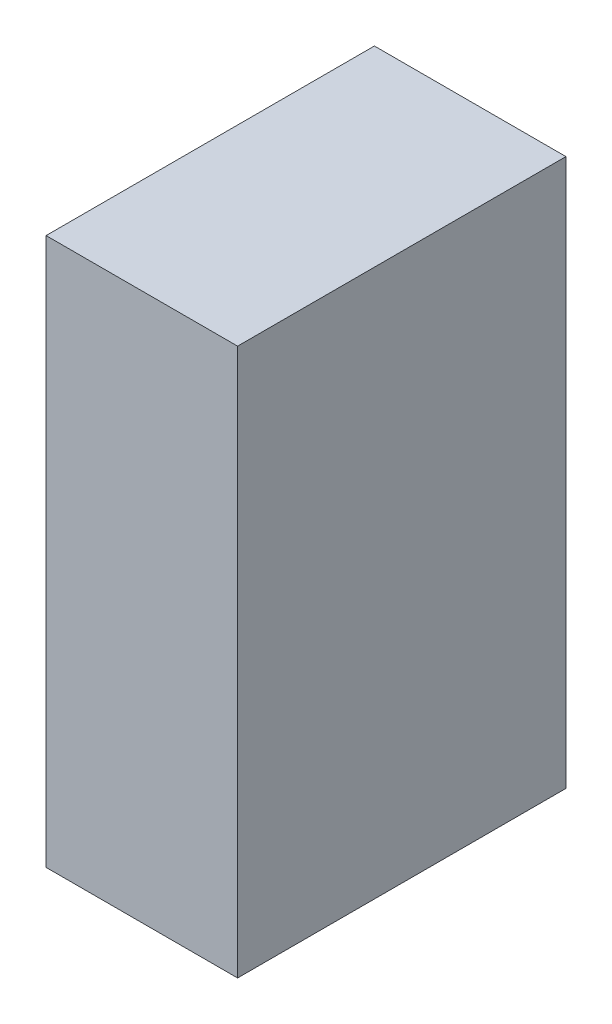
ISO-10303-21;
HEADER;
FILE_DESCRIPTION(('STEP AP214'),'2;1');
FILE_NAME('part.step','',(''),(''),'','','');
FILE_SCHEMA(('AUTOMOTIVE_DESIGN { 1 0 10303 214 1 1 1 1 }'));
ENDSEC;
DATA;
#1=APPLICATION_CONTEXT('core data for automotive mechanical design processes');
#2=APPLICATION_PROTOCOL_DEFINITION('international standard','automotive_design',2000,#1);
#3=PRODUCT_CONTEXT('',#1,'mechanical');
#4=PRODUCT('Part','Part','',(#3));
#5=PRODUCT_RELATED_PRODUCT_CATEGORY('part','',(#4));
#6=PRODUCT_DEFINITION_FORMATION('','',#4);
#7=PRODUCT_DEFINITION_CONTEXT('part definition',#1,'design');
#8=PRODUCT_DEFINITION('design','',#6,#7);
#9=PRODUCT_DEFINITION_SHAPE('','',#8);
#10=(LENGTH_UNIT() NAMED_UNIT(*) SI_UNIT(.MILLI.,.METRE.));
#11=(NAMED_UNIT(*) PLANE_ANGLE_UNIT() SI_UNIT($,.RADIAN.));
#12=(NAMED_UNIT(*) SI_UNIT($,.STERADIAN.) SOLID_ANGLE_UNIT());
#13=UNCERTAINTY_MEASURE_WITH_UNIT(LENGTH_MEASURE(1.E-05),#10,'distance_accuracy_value','');
#14=(GEOMETRIC_REPRESENTATION_CONTEXT(3) GLOBAL_UNCERTAINTY_ASSIGNED_CONTEXT((#13)) GLOBAL_UNIT_ASSIGNED_CONTEXT((#10,
#11,#12)) REPRESENTATION_CONTEXT('',''));
#15=CARTESIAN_POINT('',(0.,0.,0.));
#16=DIRECTION('',(0.,0.,1.));
#17=DIRECTION('',(1.,0.,0.));
#18=AXIS2_PLACEMENT_3D('',#15,#16,#17);
#19=CARTESIAN_POINT('',(565.,180.,-248.));
#20=DIRECTION('',(-1.,0.,0.));
#21=DIRECTION('',(0.,0.,1.));
#22=AXIS2_PLACEMENT_3D('',#19,#20,#21);
#23=PLANE('',#22);
#24=DIRECTION('',(0.,-1.,0.));
#25=VECTOR('',#24,1.);
#26=CARTESIAN_POINT('',(565.,180.,-188.));
#27=LINE('',#26,#25);
#28=CARTESIAN_POINT('',(565.,280.,-188.));
#29=VERTEX_POINT('',#28);
#30=CARTESIAN_POINT('',(565.,180.,-188.));
#31=VERTEX_POINT('',#30);
#32=EDGE_CURVE('E103',#29,#31,#27,.T.);
#33=ORIENTED_EDGE('',*,*,#32,.F.);
#34=DIRECTION('',(0.,0.,1.));
#35=VECTOR('',#34,1.);
#36=CARTESIAN_POINT('',(565.,280.,-248.));
#37=LINE('',#36,#35);
#38=CARTESIAN_POINT('',(565.,280.,-248.));
#39=VERTEX_POINT('',#38);
#40=EDGE_CURVE('E11',#39,#29,#37,.T.);
#41=ORIENTED_EDGE('',*,*,#40,.F.);
#42=DIRECTION('',(0.,-1.,0.));
#43=VECTOR('',#42,1.);
#44=CARTESIAN_POINT('',(565.,180.,-248.));
#45=LINE('',#44,#43);
#46=CARTESIAN_POINT('',(565.,180.,-248.));
#47=VERTEX_POINT('',#46);
#48=EDGE_CURVE('E97',#39,#47,#45,.T.);
#49=ORIENTED_EDGE('',*,*,#48,.T.);
#50=DIRECTION('',(0.,0.,1.));
#51=VECTOR('',#50,1.);
#52=CARTESIAN_POINT('',(565.,180.,-248.));
#53=LINE('',#52,#51);
#54=EDGE_CURVE('E42',#47,#31,#53,.T.);
#55=ORIENTED_EDGE('',*,*,#54,.T.);
#56=EDGE_LOOP('',(#33,#41,#49,#55));
#57=FACE_BOUND('',#56,.T.);
#58=ADVANCED_FACE('F39',(#57),#23,.T.);
#59=CARTESIAN_POINT('',(565.,280.,-248.));
#60=DIRECTION('',(0.,1.,0.));
#61=DIRECTION('',(0.,0.,1.));
#62=AXIS2_PLACEMENT_3D('',#59,#60,#61);
#63=PLANE('',#62);
#64=DIRECTION('',(-1.,0.,0.));
#65=VECTOR('',#64,1.);
#66=CARTESIAN_POINT('',(565.,280.,-188.));
#67=LINE('',#66,#65);
#68=CARTESIAN_POINT('',(600.,280.,-188.));
#69=VERTEX_POINT('',#68);
#70=EDGE_CURVE('E99',#69,#29,#67,.T.);
#71=ORIENTED_EDGE('',*,*,#70,.F.);
#72=DIRECTION('',(0.,0.,1.));
#73=VECTOR('',#72,1.);
#74=CARTESIAN_POINT('',(600.,280.,-248.));
#75=LINE('',#74,#73);
#76=CARTESIAN_POINT('',(600.,280.,-248.));
#77=VERTEX_POINT('',#76);
#78=EDGE_CURVE('E48',#77,#69,#75,.T.);
#79=ORIENTED_EDGE('',*,*,#78,.F.);
#80=DIRECTION('',(-1.,0.,0.));
#81=VECTOR('',#80,1.);
#82=CARTESIAN_POINT('',(565.,280.,-248.));
#83=LINE('',#82,#81);
#84=EDGE_CURVE('E94',#77,#39,#83,.T.);
#85=ORIENTED_EDGE('',*,*,#84,.T.);
#86=ORIENTED_EDGE('',*,*,#40,.T.);
#87=EDGE_LOOP('',(#71,#79,#85,#86));
#88=FACE_BOUND('',#87,.T.);
#89=ADVANCED_FACE('F113',(#88),#63,.T.);
#90=CARTESIAN_POINT('',(600.,180.,-248.));
#91=DIRECTION('',(1.,0.,0.));
#92=DIRECTION('',(0.,0.,-1.));
#93=AXIS2_PLACEMENT_3D('',#90,#91,#92);
#94=PLANE('',#93);
#95=DIRECTION('',(0.,1.,0.));
#96=VECTOR('',#95,1.);
#97=CARTESIAN_POINT('',(600.,180.,-188.));
#98=LINE('',#97,#96);
#99=CARTESIAN_POINT('',(600.,180.,-188.));
#100=VERTEX_POINT('',#99);
#101=EDGE_CURVE('E89',#100,#69,#98,.T.);
#102=ORIENTED_EDGE('',*,*,#101,.F.);
#103=DIRECTION('',(0.,0.,1.));
#104=VECTOR('',#103,1.);
#105=CARTESIAN_POINT('',(600.,180.,-248.));
#106=LINE('',#105,#104);
#107=CARTESIAN_POINT('',(600.,180.,-248.));
#108=VERTEX_POINT('',#107);
#109=EDGE_CURVE('E84',#108,#100,#106,.T.);
#110=ORIENTED_EDGE('',*,*,#109,.F.);
#111=DIRECTION('',(0.,1.,0.));
#112=VECTOR('',#111,1.);
#113=CARTESIAN_POINT('',(600.,180.,-248.));
#114=LINE('',#113,#112);
#115=EDGE_CURVE('E87',#108,#77,#114,.T.);
#116=ORIENTED_EDGE('',*,*,#115,.T.);
#117=ORIENTED_EDGE('',*,*,#78,.T.);
#118=EDGE_LOOP('',(#102,#110,#116,#117));
#119=FACE_BOUND('',#118,.T.);
#120=ADVANCED_FACE('F86',(#119),#94,.T.);
#121=CARTESIAN_POINT('',(565.,180.,-248.));
#122=DIRECTION('',(0.,-1.,0.));
#123=DIRECTION('',(0.,0.,-1.));
#124=AXIS2_PLACEMENT_3D('',#121,#122,#123);
#125=PLANE('',#124);
#126=DIRECTION('',(1.,0.,0.));
#127=VECTOR('',#126,1.);
#128=CARTESIAN_POINT('',(565.,180.,-188.));
#129=LINE('',#128,#127);
#130=EDGE_CURVE('E106',#31,#100,#129,.T.);
#131=ORIENTED_EDGE('',*,*,#130,.F.);
#132=ORIENTED_EDGE('',*,*,#54,.F.);
#133=DIRECTION('',(1.,0.,0.));
#134=VECTOR('',#133,1.);
#135=CARTESIAN_POINT('',(565.,180.,-248.));
#136=LINE('',#135,#134);
#137=EDGE_CURVE('E93',#47,#108,#136,.T.);
#138=ORIENTED_EDGE('',*,*,#137,.T.);
#139=ORIENTED_EDGE('',*,*,#109,.T.);
#140=EDGE_LOOP('',(#131,#132,#138,#139));
#141=FACE_BOUND('',#140,.T.);
#142=ADVANCED_FACE('F96',(#141),#125,.T.);
#143=CARTESIAN_POINT('',(0.,0.,-248.));
#144=DIRECTION('',(0.,0.,-1.));
#145=DIRECTION('',(-1.,0.,0.));
#146=AXIS2_PLACEMENT_3D('',#143,#144,#145);
#147=PLANE('',#146);
#148=ORIENTED_EDGE('',*,*,#48,.F.);
#149=ORIENTED_EDGE('',*,*,#84,.F.);
#150=ORIENTED_EDGE('',*,*,#115,.F.);
#151=ORIENTED_EDGE('',*,*,#137,.F.);
#152=EDGE_LOOP('',(#148,#149,#150,#151));
#153=FACE_BOUND('',#152,.T.);
#154=ADVANCED_FACE('F92',(#153),#147,.T.);
#155=CARTESIAN_POINT('',(0.,0.,-188.));
#156=DIRECTION('',(0.,0.,-1.));
#157=DIRECTION('',(-1.,0.,0.));
#158=AXIS2_PLACEMENT_3D('',#155,#156,#157);
#159=PLANE('',#158);
#160=ORIENTED_EDGE('',*,*,#32,.T.);
#161=ORIENTED_EDGE('',*,*,#130,.T.);
#162=ORIENTED_EDGE('',*,*,#101,.T.);
#163=ORIENTED_EDGE('',*,*,#70,.T.);
#164=EDGE_LOOP('',(#160,#161,#162,#163));
#165=FACE_BOUND('',#164,.T.);
#166=ADVANCED_FACE('F112',(#165),#159,.F.);
#167=CLOSED_SHELL('',(#58,#89,#120,#142,#154,#166));
#168=MANIFOLD_SOLID_BREP('B2',#167);
#169=ADVANCED_BREP_SHAPE_REPRESENTATION('',(#18,#168),#14);
#170=SHAPE_DEFINITION_REPRESENTATION(#9,#169);
ENDSEC;
END-ISO-10303-21;
